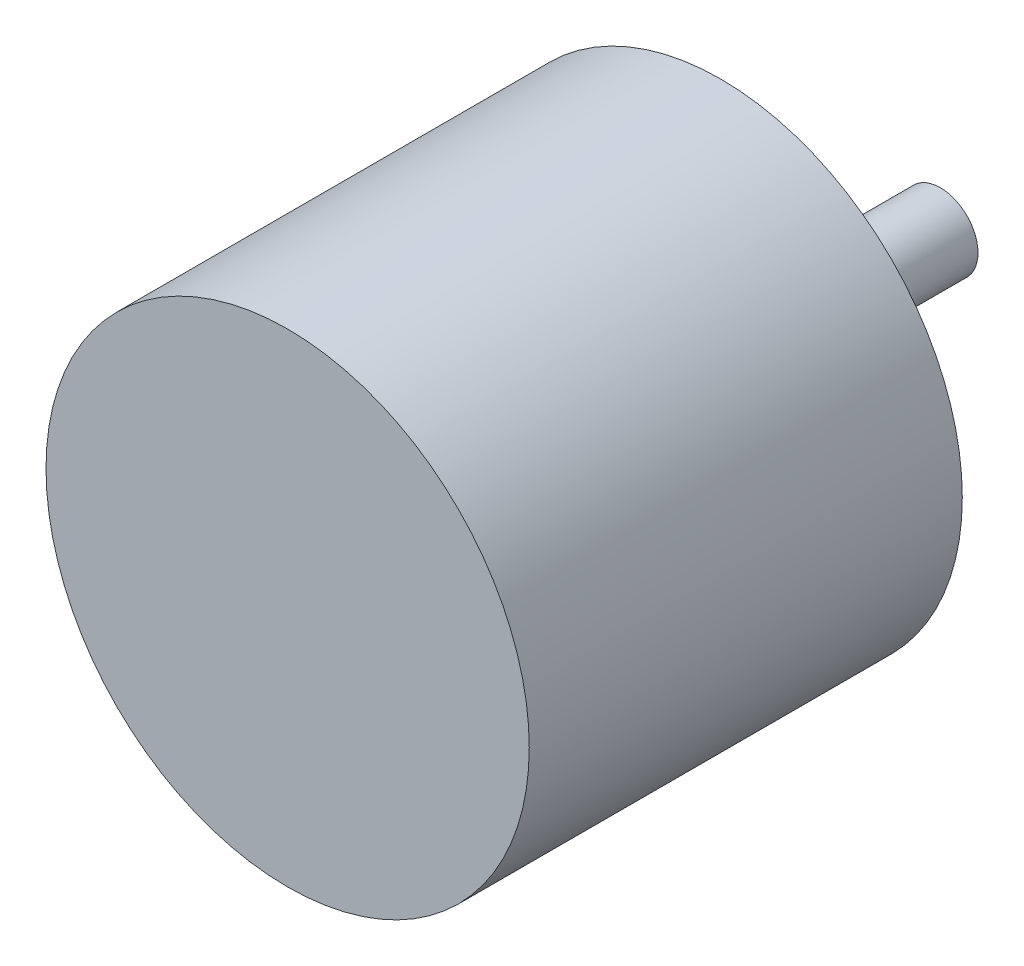
ISO-10303-21;
HEADER;
FILE_DESCRIPTION(('STEP AP214'),'2;1');
FILE_NAME('part.step','',(''),(''),'','','');
FILE_SCHEMA(('AUTOMOTIVE_DESIGN { 1 0 10303 214 1 1 1 1 }'));
ENDSEC;
DATA;
#1=APPLICATION_CONTEXT('core data for automotive mechanical design processes');
#2=APPLICATION_PROTOCOL_DEFINITION('international standard','automotive_design',2000,#1);
#3=PRODUCT_CONTEXT('',#1,'mechanical');
#4=PRODUCT('Part','Part','',(#3));
#5=PRODUCT_RELATED_PRODUCT_CATEGORY('part','',(#4));
#6=PRODUCT_DEFINITION_FORMATION('','',#4);
#7=PRODUCT_DEFINITION_CONTEXT('part definition',#1,'design');
#8=PRODUCT_DEFINITION('design','',#6,#7);
#9=PRODUCT_DEFINITION_SHAPE('','',#8);
#10=(LENGTH_UNIT() NAMED_UNIT(*) SI_UNIT(.MILLI.,.METRE.));
#11=(NAMED_UNIT(*) PLANE_ANGLE_UNIT() SI_UNIT($,.RADIAN.));
#12=(NAMED_UNIT(*) SI_UNIT($,.STERADIAN.) SOLID_ANGLE_UNIT());
#13=UNCERTAINTY_MEASURE_WITH_UNIT(LENGTH_MEASURE(1.E-05),#10,'distance_accuracy_value','');
#14=(GEOMETRIC_REPRESENTATION_CONTEXT(3) GLOBAL_UNCERTAINTY_ASSIGNED_CONTEXT((#13)) GLOBAL_UNIT_ASSIGNED_CONTEXT((#10,
#11,#12)) REPRESENTATION_CONTEXT('',''));
#15=CARTESIAN_POINT('',(0.,0.,0.));
#16=DIRECTION('',(0.,0.,1.));
#17=DIRECTION('',(1.,0.,0.));
#18=AXIS2_PLACEMENT_3D('',#15,#16,#17);
#19=CARTESIAN_POINT('',(0.,0.,34.5));
#20=DIRECTION('',(0.,0.,-1.));
#21=DIRECTION('',(-1.,0.,0.));
#22=AXIS2_PLACEMENT_3D('',#19,#20,#21);
#23=CYLINDRICAL_SURFACE('',#22,19.25);
#24=CARTESIAN_POINT('',(0.,0.,34.5));
#25=DIRECTION('',(0.,0.,1.));
#26=DIRECTION('',(1.,0.,0.));
#27=AXIS2_PLACEMENT_3D('',#24,#25,#26);
#28=CIRCLE('',#27,19.25);
#29=CARTESIAN_POINT('',(19.25,0.,34.5));
#30=VERTEX_POINT('',#29);
#31=EDGE_CURVE('E10',#30,#30,#28,.T.);
#32=ORIENTED_EDGE('',*,*,#31,.F.);
#33=EDGE_LOOP('',(#32));
#34=FACE_BOUND('',#33,.T.);
#35=CARTESIAN_POINT('',(0.,0.,0.));
#36=DIRECTION('',(0.,0.,1.));
#37=DIRECTION('',(1.,0.,0.));
#38=AXIS2_PLACEMENT_3D('',#35,#36,#37);
#39=CIRCLE('',#38,19.25);
#40=CARTESIAN_POINT('',(19.25,0.,0.));
#41=VERTEX_POINT('',#40);
#42=EDGE_CURVE('E40',#41,#41,#39,.T.);
#43=ORIENTED_EDGE('',*,*,#42,.T.);
#44=EDGE_LOOP('',(#43));
#45=FACE_BOUND('',#44,.T.);
#46=ADVANCED_FACE('F37',(#34,#45),#23,.T.);
#47=CARTESIAN_POINT('',(0.,0.,34.5));
#48=DIRECTION('',(0.,0.,1.));
#49=DIRECTION('',(1.,0.,0.));
#50=AXIS2_PLACEMENT_3D('',#47,#48,#49);
#51=PLANE('',#50);
#52=ORIENTED_EDGE('',*,*,#31,.T.);
#53=EDGE_LOOP('',(#52));
#54=FACE_BOUND('',#53,.T.);
#55=ADVANCED_FACE('F79',(#54),#51,.T.);
#56=CARTESIAN_POINT('',(0.,0.,0.));
#57=DIRECTION('',(0.,0.,1.));
#58=DIRECTION('',(1.,0.,0.));
#59=AXIS2_PLACEMENT_3D('',#56,#57,#58);
#60=PLANE('',#59);
#61=CARTESIAN_POINT('',(0.,0.,0.));
#62=DIRECTION('',(0.,0.,1.));
#63=DIRECTION('',(1.,0.,0.));
#64=AXIS2_PLACEMENT_3D('',#61,#62,#63);
#65=CIRCLE('',#64,10.);
#66=CARTESIAN_POINT('',(10.,0.,0.));
#67=VERTEX_POINT('',#66);
#68=EDGE_CURVE('E51',#67,#67,#65,.T.);
#69=ORIENTED_EDGE('',*,*,#68,.T.);
#70=EDGE_LOOP('',(#69));
#71=FACE_BOUND('',#70,.T.);
#72=ORIENTED_EDGE('',*,*,#42,.F.);
#73=EDGE_LOOP('',(#72));
#74=FACE_BOUND('',#73,.T.);
#75=ADVANCED_FACE('F84',(#71,#74),#60,.F.);
#76=CARTESIAN_POINT('',(0.,0.,-5.));
#77=DIRECTION('',(0.,0.,1.));
#78=DIRECTION('',(1.,0.,0.));
#79=AXIS2_PLACEMENT_3D('',#76,#77,#78);
#80=CYLINDRICAL_SURFACE('',#79,10.);
#81=CARTESIAN_POINT('',(0.,0.,-5.));
#82=DIRECTION('',(0.,0.,1.));
#83=DIRECTION('',(1.,0.,0.));
#84=AXIS2_PLACEMENT_3D('',#81,#82,#83);
#85=CIRCLE('',#84,10.);
#86=CARTESIAN_POINT('',(10.,0.,-5.));
#87=VERTEX_POINT('',#86);
#88=EDGE_CURVE('E49',#87,#87,#85,.T.);
#89=ORIENTED_EDGE('',*,*,#88,.T.);
#90=EDGE_LOOP('',(#89));
#91=FACE_BOUND('',#90,.T.);
#92=ORIENTED_EDGE('',*,*,#68,.F.);
#93=EDGE_LOOP('',(#92));
#94=FACE_BOUND('',#93,.T.);
#95=ADVANCED_FACE('F90',(#91,#94),#80,.T.);
#96=CARTESIAN_POINT('',(0.,0.,-5.));
#97=DIRECTION('',(0.,0.,1.));
#98=DIRECTION('',(1.,0.,0.));
#99=AXIS2_PLACEMENT_3D('',#96,#97,#98);
#100=PLANE('',#99);
#101=CARTESIAN_POINT('',(0.,0.,-5.));
#102=DIRECTION('',(0.,0.,1.));
#103=DIRECTION('',(1.,0.,0.));
#104=AXIS2_PLACEMENT_3D('',#101,#102,#103);
#105=CIRCLE('',#104,3.);
#106=CARTESIAN_POINT('',(3.,0.,-5.));
#107=VERTEX_POINT('',#106);
#108=EDGE_CURVE('E55',#107,#107,#105,.T.);
#109=ORIENTED_EDGE('',*,*,#108,.T.);
#110=EDGE_LOOP('',(#109));
#111=FACE_BOUND('',#110,.T.);
#112=ORIENTED_EDGE('',*,*,#88,.F.);
#113=EDGE_LOOP('',(#112));
#114=FACE_BOUND('',#113,.T.);
#115=ADVANCED_FACE('F76',(#111,#114),#100,.F.);
#116=CARTESIAN_POINT('',(0.,0.,-17.5));
#117=DIRECTION('',(0.,0.,1.));
#118=DIRECTION('',(1.,0.,0.));
#119=AXIS2_PLACEMENT_3D('',#116,#117,#118);
#120=CYLINDRICAL_SURFACE('',#119,3.);
#121=CARTESIAN_POINT('',(0.,0.,-17.5));
#122=DIRECTION('',(0.,0.,1.));
#123=DIRECTION('',(1.,0.,0.));
#124=AXIS2_PLACEMENT_3D('',#121,#122,#123);
#125=CIRCLE('',#124,3.);
#126=CARTESIAN_POINT('',(3.,0.,-17.5));
#127=VERTEX_POINT('',#126);
#128=EDGE_CURVE('E62',#127,#127,#125,.T.);
#129=ORIENTED_EDGE('',*,*,#128,.T.);
#130=EDGE_LOOP('',(#129));
#131=FACE_BOUND('',#130,.T.);
#132=ORIENTED_EDGE('',*,*,#108,.F.);
#133=EDGE_LOOP('',(#132));
#134=FACE_BOUND('',#133,.T.);
#135=ADVANCED_FACE('F67',(#131,#134),#120,.T.);
#136=CARTESIAN_POINT('',(0.,0.,-17.5));
#137=DIRECTION('',(0.,0.,1.));
#138=DIRECTION('',(1.,0.,0.));
#139=AXIS2_PLACEMENT_3D('',#136,#137,#138);
#140=PLANE('',#139);
#141=ORIENTED_EDGE('',*,*,#128,.F.);
#142=EDGE_LOOP('',(#141));
#143=FACE_BOUND('',#142,.T.);
#144=ADVANCED_FACE('F70',(#143),#140,.F.);
#145=CLOSED_SHELL('',(#46,#55,#75,#95,#115,#135,#144));
#146=MANIFOLD_SOLID_BREP('B2',#145);
#147=ADVANCED_BREP_SHAPE_REPRESENTATION('',(#18,#146),#14);
#148=SHAPE_DEFINITION_REPRESENTATION(#9,#147);
ENDSEC;
END-ISO-10303-21;
